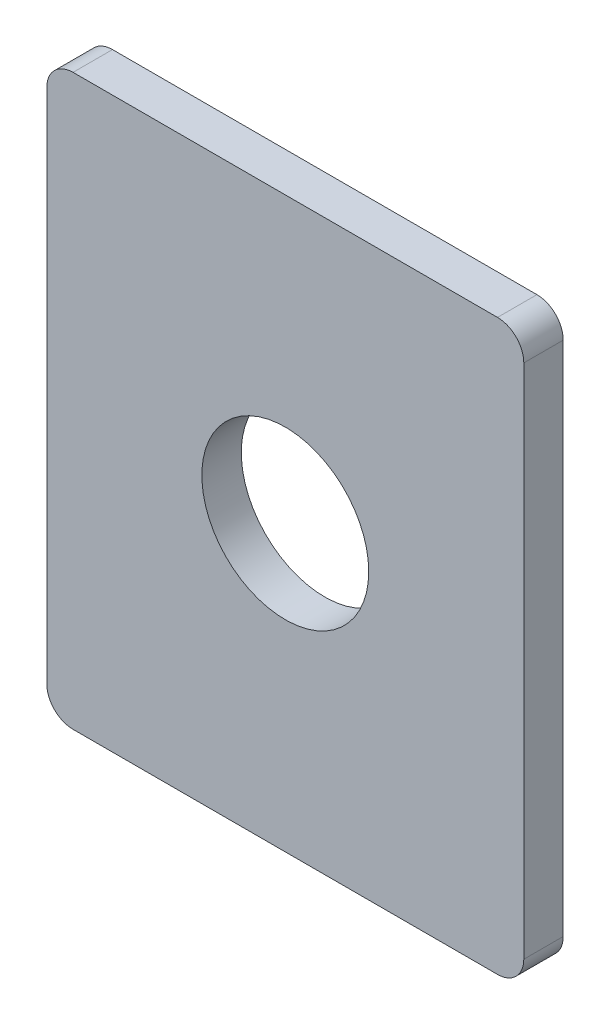
ISO-10303-21;
HEADER;
FILE_DESCRIPTION(('STEP AP214'),'2;1');
FILE_NAME('part.step','',(''),(''),'','','');
FILE_SCHEMA(('AUTOMOTIVE_DESIGN { 1 0 10303 214 1 1 1 1 }'));
ENDSEC;
DATA;
#1=APPLICATION_CONTEXT('core data for automotive mechanical design processes');
#2=APPLICATION_PROTOCOL_DEFINITION('international standard','automotive_design',2000,#1);
#3=PRODUCT_CONTEXT('',#1,'mechanical');
#4=PRODUCT('Part','Part','',(#3));
#5=PRODUCT_RELATED_PRODUCT_CATEGORY('part','',(#4));
#6=PRODUCT_DEFINITION_FORMATION('','',#4);
#7=PRODUCT_DEFINITION_CONTEXT('part definition',#1,'design');
#8=PRODUCT_DEFINITION('design','',#6,#7);
#9=PRODUCT_DEFINITION_SHAPE('','',#8);
#10=(LENGTH_UNIT() NAMED_UNIT(*) SI_UNIT(.MILLI.,.METRE.));
#11=(NAMED_UNIT(*) PLANE_ANGLE_UNIT() SI_UNIT($,.RADIAN.));
#12=(NAMED_UNIT(*) SI_UNIT($,.STERADIAN.) SOLID_ANGLE_UNIT());
#13=UNCERTAINTY_MEASURE_WITH_UNIT(LENGTH_MEASURE(1.E-05),#10,'distance_accuracy_value','');
#14=(GEOMETRIC_REPRESENTATION_CONTEXT(3) GLOBAL_UNCERTAINTY_ASSIGNED_CONTEXT((#13)) GLOBAL_UNIT_ASSIGNED_CONTEXT((#10,
#11,#12)) REPRESENTATION_CONTEXT('',''));
#15=CARTESIAN_POINT('',(0.,0.,0.));
#16=DIRECTION('',(0.,0.,1.));
#17=DIRECTION('',(1.,0.,0.));
#18=AXIS2_PLACEMENT_3D('',#15,#16,#17);
#19=CARTESIAN_POINT('',(0.,0.,3.));
#20=DIRECTION('',(0.,0.,1.));
#21=DIRECTION('',(1.,0.,0.));
#22=AXIS2_PLACEMENT_3D('',#19,#20,#21);
#23=PLANE('',#22);
#24=DIRECTION('',(-1.,0.,0.));
#25=VECTOR('',#24,1.);
#26=CARTESIAN_POINT('',(-18.15,21.65,3.));
#27=LINE('',#26,#25);
#28=CARTESIAN_POINT('',(16.15,21.65,3.));
#29=VERTEX_POINT('',#28);
#30=CARTESIAN_POINT('',(-16.15,21.65,3.));
#31=VERTEX_POINT('',#30);
#32=EDGE_CURVE('E177',#29,#31,#27,.T.);
#33=ORIENTED_EDGE('',*,*,#32,.T.);
#34=CARTESIAN_POINT('',(-16.15,19.65,3.));
#35=DIRECTION('',(0.,0.,1.));
#36=DIRECTION('',(1.,0.,0.));
#37=AXIS2_PLACEMENT_3D('',#34,#35,#36);
#38=CIRCLE('',#37,2.);
#39=CARTESIAN_POINT('',(-18.15,19.65,3.));
#40=VERTEX_POINT('',#39);
#41=EDGE_CURVE('E158',#31,#40,#38,.T.);
#42=ORIENTED_EDGE('',*,*,#41,.T.);
#43=DIRECTION('',(0.,-1.,0.));
#44=VECTOR('',#43,1.);
#45=CARTESIAN_POINT('',(-18.15,21.65,3.));
#46=LINE('',#45,#44);
#47=CARTESIAN_POINT('',(-18.15,-19.65,3.));
#48=VERTEX_POINT('',#47);
#49=EDGE_CURVE('E128',#40,#48,#46,.T.);
#50=ORIENTED_EDGE('',*,*,#49,.T.);
#51=CARTESIAN_POINT('',(-16.15,-19.65,3.));
#52=DIRECTION('',(0.,0.,1.));
#53=DIRECTION('',(1.,0.,0.));
#54=AXIS2_PLACEMENT_3D('',#51,#52,#53);
#55=CIRCLE('',#54,2.);
#56=CARTESIAN_POINT('',(-16.15,-21.65,3.));
#57=VERTEX_POINT('',#56);
#58=EDGE_CURVE('E64',#48,#57,#55,.T.);
#59=ORIENTED_EDGE('',*,*,#58,.T.);
#60=DIRECTION('',(1.,0.,0.));
#61=VECTOR('',#60,1.);
#62=CARTESIAN_POINT('',(-18.15,-21.65,3.));
#63=LINE('',#62,#61);
#64=CARTESIAN_POINT('',(16.15,-21.65,3.));
#65=VERTEX_POINT('',#64);
#66=EDGE_CURVE('E144',#57,#65,#63,.T.);
#67=ORIENTED_EDGE('',*,*,#66,.T.);
#68=CARTESIAN_POINT('',(16.15,-19.65,3.));
#69=DIRECTION('',(0.,0.,1.));
#70=DIRECTION('',(1.,0.,0.));
#71=AXIS2_PLACEMENT_3D('',#68,#69,#70);
#72=CIRCLE('',#71,2.);
#73=CARTESIAN_POINT('',(18.15,-19.65,3.));
#74=VERTEX_POINT('',#73);
#75=EDGE_CURVE('E155',#65,#74,#72,.T.);
#76=ORIENTED_EDGE('',*,*,#75,.T.);
#77=DIRECTION('',(0.,1.,0.));
#78=VECTOR('',#77,1.);
#79=CARTESIAN_POINT('',(18.15,21.65,3.));
#80=LINE('',#79,#78);
#81=CARTESIAN_POINT('',(18.15,19.65,3.));
#82=VERTEX_POINT('',#81);
#83=EDGE_CURVE('E138',#74,#82,#80,.T.);
#84=ORIENTED_EDGE('',*,*,#83,.T.);
#85=CARTESIAN_POINT('',(16.15,19.65,3.));
#86=DIRECTION('',(0.,0.,1.));
#87=DIRECTION('',(1.,0.,0.));
#88=AXIS2_PLACEMENT_3D('',#85,#86,#87);
#89=CIRCLE('',#88,2.);
#90=EDGE_CURVE('E153',#82,#29,#89,.T.);
#91=ORIENTED_EDGE('',*,*,#90,.T.);
#92=EDGE_LOOP('',(#33,#42,#50,#59,#67,#76,#84,#91));
#93=FACE_BOUND('',#92,.T.);
#94=CARTESIAN_POINT('',(0.,0.,3.));
#95=DIRECTION('',(0.,0.,1.));
#96=DIRECTION('',(1.,0.,0.));
#97=AXIS2_PLACEMENT_3D('',#94,#95,#96);
#98=CIRCLE('',#97,6.35);
#99=CARTESIAN_POINT('',(6.34999999999999,0.,3.));
#100=VERTEX_POINT('',#99);
#101=EDGE_CURVE('E182',#100,#100,#98,.T.);
#102=ORIENTED_EDGE('',*,*,#101,.F.);
#103=EDGE_LOOP('',(#102));
#104=FACE_BOUND('',#103,.T.);
#105=ADVANCED_FACE('F42',(#93,#104),#23,.T.);
#106=CARTESIAN_POINT('',(0.,0.,0.));
#107=DIRECTION('',(0.,0.,1.));
#108=DIRECTION('',(1.,0.,0.));
#109=AXIS2_PLACEMENT_3D('',#106,#107,#108);
#110=PLANE('',#109);
#111=DIRECTION('',(0.,-1.,0.));
#112=VECTOR('',#111,1.);
#113=CARTESIAN_POINT('',(-18.15,21.65,0.));
#114=LINE('',#113,#112);
#115=CARTESIAN_POINT('',(-18.15,19.65,0.));
#116=VERTEX_POINT('',#115);
#117=CARTESIAN_POINT('',(-18.15,-19.65,0.));
#118=VERTEX_POINT('',#117);
#119=EDGE_CURVE('E126',#116,#118,#114,.T.);
#120=ORIENTED_EDGE('',*,*,#119,.F.);
#121=CARTESIAN_POINT('',(-16.15,19.65,0.));
#122=DIRECTION('',(0.,0.,1.));
#123=DIRECTION('',(1.,0.,0.));
#124=AXIS2_PLACEMENT_3D('',#121,#122,#123);
#125=CIRCLE('',#124,2.);
#126=CARTESIAN_POINT('',(-16.15,21.65,0.));
#127=VERTEX_POINT('',#126);
#128=EDGE_CURVE('E109',#116,#127,#125,.F.);
#129=ORIENTED_EDGE('',*,*,#128,.T.);
#130=DIRECTION('',(-1.,0.,0.));
#131=VECTOR('',#130,1.);
#132=CARTESIAN_POINT('',(-18.15,21.65,0.));
#133=LINE('',#132,#131);
#134=CARTESIAN_POINT('',(16.15,21.65,0.));
#135=VERTEX_POINT('',#134);
#136=EDGE_CURVE('E136',#135,#127,#133,.T.);
#137=ORIENTED_EDGE('',*,*,#136,.F.);
#138=CARTESIAN_POINT('',(16.15,19.65,0.));
#139=DIRECTION('',(0.,0.,1.));
#140=DIRECTION('',(1.,0.,0.));
#141=AXIS2_PLACEMENT_3D('',#138,#139,#140);
#142=CIRCLE('',#141,2.);
#143=CARTESIAN_POINT('',(18.15,19.65,0.));
#144=VERTEX_POINT('',#143);
#145=EDGE_CURVE('E129',#135,#144,#142,.F.);
#146=ORIENTED_EDGE('',*,*,#145,.T.);
#147=DIRECTION('',(0.,1.,0.));
#148=VECTOR('',#147,1.);
#149=CARTESIAN_POINT('',(18.15,21.65,0.));
#150=LINE('',#149,#148);
#151=CARTESIAN_POINT('',(18.15,-19.65,0.));
#152=VERTEX_POINT('',#151);
#153=EDGE_CURVE('E140',#152,#144,#150,.T.);
#154=ORIENTED_EDGE('',*,*,#153,.F.);
#155=CARTESIAN_POINT('',(16.15,-19.65,0.));
#156=DIRECTION('',(0.,0.,1.));
#157=DIRECTION('',(1.,0.,0.));
#158=AXIS2_PLACEMENT_3D('',#155,#156,#157);
#159=CIRCLE('',#158,2.);
#160=CARTESIAN_POINT('',(16.15,-21.65,0.));
#161=VERTEX_POINT('',#160);
#162=EDGE_CURVE('E147',#152,#161,#159,.F.);
#163=ORIENTED_EDGE('',*,*,#162,.T.);
#164=DIRECTION('',(1.,0.,0.));
#165=VECTOR('',#164,1.);
#166=CARTESIAN_POINT('',(-18.15,-21.65,0.));
#167=LINE('',#166,#165);
#168=CARTESIAN_POINT('',(-16.15,-21.65,0.));
#169=VERTEX_POINT('',#168);
#170=EDGE_CURVE('E135',#169,#161,#167,.T.);
#171=ORIENTED_EDGE('',*,*,#170,.F.);
#172=CARTESIAN_POINT('',(-16.15,-19.65,0.));
#173=DIRECTION('',(0.,0.,1.));
#174=DIRECTION('',(1.,0.,0.));
#175=AXIS2_PLACEMENT_3D('',#172,#173,#174);
#176=CIRCLE('',#175,2.);
#177=EDGE_CURVE('E120',#169,#118,#176,.F.);
#178=ORIENTED_EDGE('',*,*,#177,.T.);
#179=EDGE_LOOP('',(#120,#129,#137,#146,#154,#163,#171,#178));
#180=FACE_BOUND('',#179,.T.);
#181=CARTESIAN_POINT('',(0.,0.,0.));
#182=DIRECTION('',(0.,0.,1.));
#183=DIRECTION('',(1.,0.,0.));
#184=AXIS2_PLACEMENT_3D('',#181,#182,#183);
#185=CIRCLE('',#184,6.35);
#186=CARTESIAN_POINT('',(6.34999999999999,0.,0.));
#187=VERTEX_POINT('',#186);
#188=EDGE_CURVE('E184',#187,#187,#185,.T.);
#189=ORIENTED_EDGE('',*,*,#188,.T.);
#190=EDGE_LOOP('',(#189));
#191=FACE_BOUND('',#190,.T.);
#192=ADVANCED_FACE('F132',(#180,#191),#110,.F.);
#193=CARTESIAN_POINT('',(18.15,21.65,3.));
#194=DIRECTION('',(-1.,0.,0.));
#195=DIRECTION('',(0.,-1.,0.));
#196=AXIS2_PLACEMENT_3D('',#193,#194,#195);
#197=PLANE('',#196);
#198=ORIENTED_EDGE('',*,*,#83,.F.);
#199=DIRECTION('',(0.,0.,-1.));
#200=VECTOR('',#199,1.);
#201=CARTESIAN_POINT('',(18.15,-19.65,3.));
#202=LINE('',#201,#200);
#203=EDGE_CURVE('E11',#74,#152,#202,.T.);
#204=ORIENTED_EDGE('',*,*,#203,.T.);
#205=ORIENTED_EDGE('',*,*,#153,.T.);
#206=DIRECTION('',(0.,0.,-1.));
#207=VECTOR('',#206,1.);
#208=CARTESIAN_POINT('',(18.15,19.65,3.));
#209=LINE('',#208,#207);
#210=EDGE_CURVE('E50',#144,#82,#209,.F.);
#211=ORIENTED_EDGE('',*,*,#210,.T.);
#212=EDGE_LOOP('',(#198,#204,#205,#211));
#213=FACE_BOUND('',#212,.T.);
#214=ADVANCED_FACE('F168',(#213),#197,.F.);
#215=CARTESIAN_POINT('',(-18.15,21.65,3.));
#216=DIRECTION('',(0.,-1.,0.));
#217=DIRECTION('',(0.,0.,-1.));
#218=AXIS2_PLACEMENT_3D('',#215,#216,#217);
#219=PLANE('',#218);
#220=ORIENTED_EDGE('',*,*,#136,.T.);
#221=DIRECTION('',(0.,0.,-1.));
#222=VECTOR('',#221,1.);
#223=CARTESIAN_POINT('',(-16.15,21.65,3.));
#224=LINE('',#223,#222);
#225=EDGE_CURVE('E114',#127,#31,#224,.F.);
#226=ORIENTED_EDGE('',*,*,#225,.T.);
#227=ORIENTED_EDGE('',*,*,#32,.F.);
#228=DIRECTION('',(0.,0.,-1.));
#229=VECTOR('',#228,1.);
#230=CARTESIAN_POINT('',(16.15,21.65,3.));
#231=LINE('',#230,#229);
#232=EDGE_CURVE('E119',#29,#135,#231,.T.);
#233=ORIENTED_EDGE('',*,*,#232,.T.);
#234=EDGE_LOOP('',(#220,#226,#227,#233));
#235=FACE_BOUND('',#234,.T.);
#236=ADVANCED_FACE('F181',(#235),#219,.F.);
#237=CARTESIAN_POINT('',(-18.15,21.65,3.));
#238=DIRECTION('',(1.,0.,0.));
#239=DIRECTION('',(0.,0.,-1.));
#240=AXIS2_PLACEMENT_3D('',#237,#238,#239);
#241=PLANE('',#240);
#242=ORIENTED_EDGE('',*,*,#49,.F.);
#243=DIRECTION('',(0.,0.,-1.));
#244=VECTOR('',#243,1.);
#245=CARTESIAN_POINT('',(-18.15,19.65,3.));
#246=LINE('',#245,#244);
#247=EDGE_CURVE('E113',#40,#116,#246,.T.);
#248=ORIENTED_EDGE('',*,*,#247,.T.);
#249=ORIENTED_EDGE('',*,*,#119,.T.);
#250=DIRECTION('',(0.,0.,-1.));
#251=VECTOR('',#250,1.);
#252=CARTESIAN_POINT('',(-18.15,-19.65,3.));
#253=LINE('',#252,#251);
#254=EDGE_CURVE('E130',#118,#48,#253,.F.);
#255=ORIENTED_EDGE('',*,*,#254,.T.);
#256=EDGE_LOOP('',(#242,#248,#249,#255));
#257=FACE_BOUND('',#256,.T.);
#258=ADVANCED_FACE('F125',(#257),#241,.F.);
#259=CARTESIAN_POINT('',(-18.15,-21.65,3.));
#260=DIRECTION('',(0.,1.,0.));
#261=DIRECTION('',(0.,0.,1.));
#262=AXIS2_PLACEMENT_3D('',#259,#260,#261);
#263=PLANE('',#262);
#264=ORIENTED_EDGE('',*,*,#66,.F.);
#265=DIRECTION('',(0.,0.,-1.));
#266=VECTOR('',#265,1.);
#267=CARTESIAN_POINT('',(-16.15,-21.65,3.));
#268=LINE('',#267,#266);
#269=EDGE_CURVE('E161',#57,#169,#268,.T.);
#270=ORIENTED_EDGE('',*,*,#269,.T.);
#271=ORIENTED_EDGE('',*,*,#170,.T.);
#272=DIRECTION('',(0.,0.,-1.));
#273=VECTOR('',#272,1.);
#274=CARTESIAN_POINT('',(16.15,-21.65,3.));
#275=LINE('',#274,#273);
#276=EDGE_CURVE('E57',#161,#65,#275,.F.);
#277=ORIENTED_EDGE('',*,*,#276,.T.);
#278=EDGE_LOOP('',(#264,#270,#271,#277));
#279=FACE_BOUND('',#278,.T.);
#280=ADVANCED_FACE('F195',(#279),#263,.F.);
#281=CARTESIAN_POINT('',(0.,0.,3.));
#282=DIRECTION('',(0.,0.,-1.));
#283=DIRECTION('',(-1.,0.,0.));
#284=AXIS2_PLACEMENT_3D('',#281,#282,#283);
#285=CYLINDRICAL_SURFACE('',#284,6.35);
#286=ORIENTED_EDGE('',*,*,#101,.T.);
#287=EDGE_LOOP('',(#286));
#288=FACE_BOUND('',#287,.T.);
#289=ORIENTED_EDGE('',*,*,#188,.F.);
#290=EDGE_LOOP('',(#289));
#291=FACE_BOUND('',#290,.T.);
#292=ADVANCED_FACE('F193',(#288,#291),#285,.F.);
#293=CARTESIAN_POINT('',(-16.15,19.65,3.));
#294=DIRECTION('',(0.,0.,-1.));
#295=DIRECTION('',(-1.,0.,0.));
#296=AXIS2_PLACEMENT_3D('',#293,#294,#295);
#297=CYLINDRICAL_SURFACE('',#296,2.);
#298=ORIENTED_EDGE('',*,*,#41,.F.);
#299=ORIENTED_EDGE('',*,*,#225,.F.);
#300=ORIENTED_EDGE('',*,*,#128,.F.);
#301=ORIENTED_EDGE('',*,*,#247,.F.);
#302=EDGE_LOOP('',(#298,#299,#300,#301));
#303=FACE_BOUND('',#302,.T.);
#304=ADVANCED_FACE('F112',(#303),#297,.T.);
#305=CARTESIAN_POINT('',(-16.15,-19.65,3.));
#306=DIRECTION('',(0.,0.,-1.));
#307=DIRECTION('',(-1.,0.,0.));
#308=AXIS2_PLACEMENT_3D('',#305,#306,#307);
#309=CYLINDRICAL_SURFACE('',#308,2.);
#310=ORIENTED_EDGE('',*,*,#58,.F.);
#311=ORIENTED_EDGE('',*,*,#254,.F.);
#312=ORIENTED_EDGE('',*,*,#177,.F.);
#313=ORIENTED_EDGE('',*,*,#269,.F.);
#314=EDGE_LOOP('',(#310,#311,#312,#313));
#315=FACE_BOUND('',#314,.T.);
#316=ADVANCED_FACE('F202',(#315),#309,.T.);
#317=CARTESIAN_POINT('',(16.15,-19.65,3.));
#318=DIRECTION('',(0.,0.,-1.));
#319=DIRECTION('',(-1.,0.,0.));
#320=AXIS2_PLACEMENT_3D('',#317,#318,#319);
#321=CYLINDRICAL_SURFACE('',#320,2.);
#322=ORIENTED_EDGE('',*,*,#75,.F.);
#323=ORIENTED_EDGE('',*,*,#276,.F.);
#324=ORIENTED_EDGE('',*,*,#162,.F.);
#325=ORIENTED_EDGE('',*,*,#203,.F.);
#326=EDGE_LOOP('',(#322,#323,#324,#325));
#327=FACE_BOUND('',#326,.T.);
#328=ADVANCED_FACE('F219',(#327),#321,.T.);
#329=CARTESIAN_POINT('',(16.15,19.65,3.));
#330=DIRECTION('',(0.,0.,-1.));
#331=DIRECTION('',(-1.,0.,0.));
#332=AXIS2_PLACEMENT_3D('',#329,#330,#331);
#333=CYLINDRICAL_SURFACE('',#332,2.);
#334=ORIENTED_EDGE('',*,*,#90,.F.);
#335=ORIENTED_EDGE('',*,*,#210,.F.);
#336=ORIENTED_EDGE('',*,*,#145,.F.);
#337=ORIENTED_EDGE('',*,*,#232,.F.);
#338=EDGE_LOOP('',(#334,#335,#336,#337));
#339=FACE_BOUND('',#338,.T.);
#340=ADVANCED_FACE('F44',(#339),#333,.T.);
#341=CLOSED_SHELL('',(#105,#192,#214,#236,#258,#280,#292,#304,#316,#328,#340));
#342=MANIFOLD_SOLID_BREP('B2',#341);
#343=ADVANCED_BREP_SHAPE_REPRESENTATION('',(#18,#342),#14);
#344=SHAPE_DEFINITION_REPRESENTATION(#9,#343);
ENDSEC;
END-ISO-10303-21;
